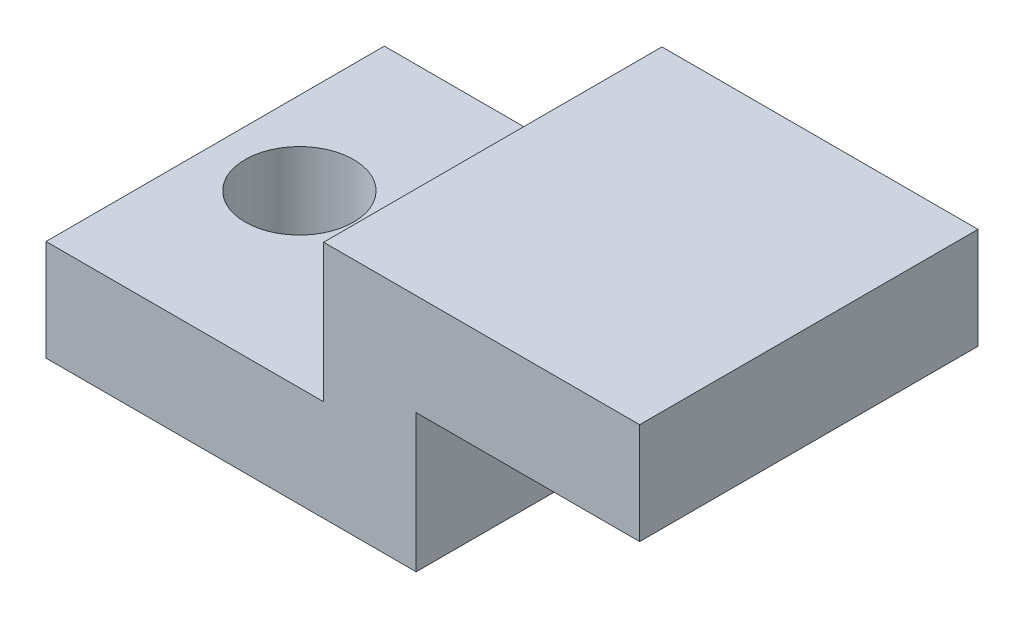
ISO-10303-21;
HEADER;
FILE_DESCRIPTION(('STEP AP214'),'2;1');
FILE_NAME('part.step','',(''),(''),'','','');
FILE_SCHEMA(('AUTOMOTIVE_DESIGN { 1 0 10303 214 1 1 1 1 }'));
ENDSEC;
DATA;
#1=APPLICATION_CONTEXT('core data for automotive mechanical design processes');
#2=APPLICATION_PROTOCOL_DEFINITION('international standard','automotive_design',2000,#1);
#3=PRODUCT_CONTEXT('',#1,'mechanical');
#4=PRODUCT('Part','Part','',(#3));
#5=PRODUCT_RELATED_PRODUCT_CATEGORY('part','',(#4));
#6=PRODUCT_DEFINITION_FORMATION('','',#4);
#7=PRODUCT_DEFINITION_CONTEXT('part definition',#1,'design');
#8=PRODUCT_DEFINITION('design','',#6,#7);
#9=PRODUCT_DEFINITION_SHAPE('','',#8);
#10=(LENGTH_UNIT() NAMED_UNIT(*) SI_UNIT(.MILLI.,.METRE.));
#11=(NAMED_UNIT(*) PLANE_ANGLE_UNIT() SI_UNIT($,.RADIAN.));
#12=(NAMED_UNIT(*) SI_UNIT($,.STERADIAN.) SOLID_ANGLE_UNIT());
#13=UNCERTAINTY_MEASURE_WITH_UNIT(LENGTH_MEASURE(1.E-05),#10,'distance_accuracy_value','');
#14=(GEOMETRIC_REPRESENTATION_CONTEXT(3) GLOBAL_UNCERTAINTY_ASSIGNED_CONTEXT((#13)) GLOBAL_UNIT_ASSIGNED_CONTEXT((#10,
#11,#12)) REPRESENTATION_CONTEXT('',''));
#15=CARTESIAN_POINT('',(0.,0.,0.));
#16=DIRECTION('',(0.,0.,1.));
#17=DIRECTION('',(1.,0.,0.));
#18=AXIS2_PLACEMENT_3D('',#15,#16,#17);
#19=CARTESIAN_POINT('',(-32.513558384062,-2.48482413759326,50.));
#20=DIRECTION('',(1.,0.,0.));
#21=DIRECTION('',(0.,0.,-1.));
#22=AXIS2_PLACEMENT_3D('',#19,#20,#21);
#23=PLANE('',#22);
#24=DIRECTION('',(0.,-1.,0.));
#25=VECTOR('',#24,1.);
#26=CARTESIAN_POINT('',(-32.513558384062,-2.48482413759326,0.));
#27=LINE('',#26,#25);
#28=CARTESIAN_POINT('',(-32.513558384062,-2.48482413759326,0.));
#29=VERTEX_POINT('',#28);
#30=CARTESIAN_POINT('',(-32.513558384062,-17.4179777057475,0.));
#31=VERTEX_POINT('',#30);
#32=EDGE_CURVE('E140',#29,#31,#27,.T.);
#33=ORIENTED_EDGE('',*,*,#32,.T.);
#34=DIRECTION('',(0.,0.,-1.));
#35=VECTOR('',#34,1.);
#36=CARTESIAN_POINT('',(-32.513558384062,-17.4179777057475,50.));
#37=LINE('',#36,#35);
#38=CARTESIAN_POINT('',(-32.513558384062,-17.4179777057475,50.));
#39=VERTEX_POINT('',#38);
#40=EDGE_CURVE('E11',#39,#31,#37,.T.);
#41=ORIENTED_EDGE('',*,*,#40,.F.);
#42=DIRECTION('',(0.,-1.,0.));
#43=VECTOR('',#42,1.);
#44=CARTESIAN_POINT('',(-32.513558384062,-2.48482413759326,50.));
#45=LINE('',#44,#43);
#46=CARTESIAN_POINT('',(-32.513558384062,-2.48482413759326,50.));
#47=VERTEX_POINT('',#46);
#48=EDGE_CURVE('E163',#47,#39,#45,.T.);
#49=ORIENTED_EDGE('',*,*,#48,.F.);
#50=DIRECTION('',(0.,0.,-1.));
#51=VECTOR('',#50,1.);
#52=CARTESIAN_POINT('',(-32.513558384062,-2.48482413759326,50.));
#53=LINE('',#52,#51);
#54=EDGE_CURVE('E136',#47,#29,#53,.T.);
#55=ORIENTED_EDGE('',*,*,#54,.T.);
#56=EDGE_LOOP('',(#33,#41,#49,#55));
#57=FACE_BOUND('',#56,.T.);
#58=ADVANCED_FACE('F39',(#57),#23,.F.);
#59=CARTESIAN_POINT('',(-32.513558384062,-17.4179777057475,50.));
#60=DIRECTION('',(0.,1.,0.));
#61=DIRECTION('',(0.,0.,1.));
#62=AXIS2_PLACEMENT_3D('',#59,#60,#61);
#63=PLANE('',#62);
#64=CARTESIAN_POINT('',(-20.2716755161703,-17.4179777057475,24.7924170990288));
#65=DIRECTION('',(0.,1.,0.));
#66=DIRECTION('',(0.,0.,1.));
#67=AXIS2_PLACEMENT_3D('',#64,#65,#66);
#68=CIRCLE('',#67,8.01591074055221);
#69=CARTESIAN_POINT('',(-20.2716755161703,-17.4179777057475,32.808327839581));
#70=VERTEX_POINT('',#69);
#71=EDGE_CURVE('E145',#70,#70,#68,.T.);
#72=ORIENTED_EDGE('',*,*,#71,.T.);
#73=EDGE_LOOP('',(#72));
#74=FACE_BOUND('',#73,.T.);
#75=DIRECTION('',(1.,0.,0.));
#76=VECTOR('',#75,1.);
#77=CARTESIAN_POINT('',(-32.513558384062,-17.4179777057475,0.));
#78=LINE('',#77,#76);
#79=CARTESIAN_POINT('',(22.1917938176931,-17.4179777057475,0.));
#80=VERTEX_POINT('',#79);
#81=EDGE_CURVE('E144',#31,#80,#78,.T.);
#82=ORIENTED_EDGE('',*,*,#81,.T.);
#83=DIRECTION('',(0.,0.,-1.));
#84=VECTOR('',#83,1.);
#85=CARTESIAN_POINT('',(22.1917938176931,-17.4179777057475,50.));
#86=LINE('',#85,#84);
#87=CARTESIAN_POINT('',(22.1917938176931,-17.4179777057475,50.));
#88=VERTEX_POINT('',#87);
#89=EDGE_CURVE('E48',#88,#80,#86,.T.);
#90=ORIENTED_EDGE('',*,*,#89,.F.);
#91=DIRECTION('',(1.,0.,0.));
#92=VECTOR('',#91,1.);
#93=CARTESIAN_POINT('',(-32.513558384062,-17.4179777057475,50.));
#94=LINE('',#93,#92);
#95=EDGE_CURVE('E99',#39,#88,#94,.T.);
#96=ORIENTED_EDGE('',*,*,#95,.F.);
#97=ORIENTED_EDGE('',*,*,#40,.T.);
#98=EDGE_LOOP('',(#82,#90,#96,#97));
#99=FACE_BOUND('',#98,.T.);
#100=ADVANCED_FACE('F229',(#74,#99),#63,.F.);
#101=CARTESIAN_POINT('',(22.1917938176931,-17.4179777057475,50.));
#102=DIRECTION('',(-1.,0.,0.));
#103=DIRECTION('',(0.,0.,1.));
#104=AXIS2_PLACEMENT_3D('',#101,#102,#103);
#105=PLANE('',#104);
#106=DIRECTION('',(0.,1.,0.));
#107=VECTOR('',#106,1.);
#108=CARTESIAN_POINT('',(22.1917938176931,-17.4179777057475,0.));
#109=LINE('',#108,#107);
#110=CARTESIAN_POINT('',(22.1917938176931,2.96750731283106,0.));
#111=VERTEX_POINT('',#110);
#112=EDGE_CURVE('E148',#80,#111,#109,.T.);
#113=ORIENTED_EDGE('',*,*,#112,.T.);
#114=DIRECTION('',(0.,0.,-1.));
#115=VECTOR('',#114,1.);
#116=CARTESIAN_POINT('',(22.1917938176931,2.96750731283106,50.));
#117=LINE('',#116,#115);
#118=CARTESIAN_POINT('',(22.1917938176931,2.96750731283106,50.));
#119=VERTEX_POINT('',#118);
#120=EDGE_CURVE('E174',#119,#111,#117,.T.);
#121=ORIENTED_EDGE('',*,*,#120,.F.);
#122=DIRECTION('',(0.,1.,0.));
#123=VECTOR('',#122,1.);
#124=CARTESIAN_POINT('',(22.1917938176931,-17.4179777057475,50.));
#125=LINE('',#124,#123);
#126=EDGE_CURVE('E184',#88,#119,#125,.T.);
#127=ORIENTED_EDGE('',*,*,#126,.F.);
#128=ORIENTED_EDGE('',*,*,#89,.T.);
#129=EDGE_LOOP('',(#113,#121,#127,#128));
#130=FACE_BOUND('',#129,.T.);
#131=ADVANCED_FACE('F182',(#130),#105,.F.);
#132=CARTESIAN_POINT('',(22.1917938176931,2.96750731283106,50.));
#133=DIRECTION('',(0.,1.,0.));
#134=DIRECTION('',(0.,0.,1.));
#135=AXIS2_PLACEMENT_3D('',#132,#133,#134);
#136=PLANE('',#135);
#137=DIRECTION('',(1.,0.,0.));
#138=VECTOR('',#137,1.);
#139=CARTESIAN_POINT('',(22.1917938176931,2.96750731283106,0.));
#140=LINE('',#139,#138);
#141=CARTESIAN_POINT('',(55.2214404300735,2.96750731283106,0.));
#142=VERTEX_POINT('',#141);
#143=EDGE_CURVE('E151',#111,#142,#140,.T.);
#144=ORIENTED_EDGE('',*,*,#143,.T.);
#145=DIRECTION('',(0.,0.,-1.));
#146=VECTOR('',#145,1.);
#147=CARTESIAN_POINT('',(55.2214404300735,2.96750731283106,50.));
#148=LINE('',#147,#146);
#149=CARTESIAN_POINT('',(55.2214404300735,2.96750731283106,50.));
#150=VERTEX_POINT('',#149);
#151=EDGE_CURVE('E170',#150,#142,#148,.T.);
#152=ORIENTED_EDGE('',*,*,#151,.F.);
#153=DIRECTION('',(1.,0.,0.));
#154=VECTOR('',#153,1.);
#155=CARTESIAN_POINT('',(22.1917938176931,2.96750731283106,50.));
#156=LINE('',#155,#154);
#157=EDGE_CURVE('E197',#119,#150,#156,.T.);
#158=ORIENTED_EDGE('',*,*,#157,.F.);
#159=ORIENTED_EDGE('',*,*,#120,.T.);
#160=EDGE_LOOP('',(#144,#152,#158,#159));
#161=FACE_BOUND('',#160,.T.);
#162=ADVANCED_FACE('F192',(#161),#136,.F.);
#163=CARTESIAN_POINT('',(55.2214404300735,2.96750731283106,50.));
#164=DIRECTION('',(-1.,0.,0.));
#165=DIRECTION('',(0.,0.,1.));
#166=AXIS2_PLACEMENT_3D('',#163,#164,#165);
#167=PLANE('',#166);
#168=DIRECTION('',(0.,1.,0.));
#169=VECTOR('',#168,1.);
#170=CARTESIAN_POINT('',(55.2214404300735,2.96750731283106,0.));
#171=LINE('',#170,#169);
#172=CARTESIAN_POINT('',(55.2214404300735,17.9340659340659,0.));
#173=VERTEX_POINT('',#172);
#174=EDGE_CURVE('E154',#142,#173,#171,.T.);
#175=ORIENTED_EDGE('',*,*,#174,.T.);
#176=DIRECTION('',(0.,0.,-1.));
#177=VECTOR('',#176,1.);
#178=CARTESIAN_POINT('',(55.2214404300735,17.9340659340659,50.));
#179=LINE('',#178,#177);
#180=CARTESIAN_POINT('',(55.2214404300735,17.9340659340659,50.));
#181=VERTEX_POINT('',#180);
#182=EDGE_CURVE('E129',#181,#173,#179,.T.);
#183=ORIENTED_EDGE('',*,*,#182,.F.);
#184=DIRECTION('',(0.,1.,0.));
#185=VECTOR('',#184,1.);
#186=CARTESIAN_POINT('',(55.2214404300735,2.96750731283106,50.));
#187=LINE('',#186,#185);
#188=EDGE_CURVE('E118',#150,#181,#187,.T.);
#189=ORIENTED_EDGE('',*,*,#188,.F.);
#190=ORIENTED_EDGE('',*,*,#151,.T.);
#191=EDGE_LOOP('',(#175,#183,#189,#190));
#192=FACE_BOUND('',#191,.T.);
#193=ADVANCED_FACE('F195',(#192),#167,.F.);
#194=CARTESIAN_POINT('',(55.2214404300735,17.9340659340659,50.));
#195=DIRECTION('',(0.,-1.,0.));
#196=DIRECTION('',(1.,0.,0.));
#197=AXIS2_PLACEMENT_3D('',#194,#195,#196);
#198=PLANE('',#197);
#199=DIRECTION('',(-1.,0.,0.));
#200=VECTOR('',#199,1.);
#201=CARTESIAN_POINT('',(55.2214404300735,17.9340659340659,0.));
#202=LINE('',#201,#200);
#203=CARTESIAN_POINT('',(8.51545576725432,17.9340659340659,0.));
#204=VERTEX_POINT('',#203);
#205=EDGE_CURVE('E127',#173,#204,#202,.T.);
#206=ORIENTED_EDGE('',*,*,#205,.T.);
#207=DIRECTION('',(0.,0.,-1.));
#208=VECTOR('',#207,1.);
#209=CARTESIAN_POINT('',(8.51545576725432,17.9340659340659,50.));
#210=LINE('',#209,#208);
#211=CARTESIAN_POINT('',(8.51545576725432,17.9340659340659,50.));
#212=VERTEX_POINT('',#211);
#213=EDGE_CURVE('E124',#212,#204,#210,.T.);
#214=ORIENTED_EDGE('',*,*,#213,.F.);
#215=DIRECTION('',(-1.,0.,0.));
#216=VECTOR('',#215,1.);
#217=CARTESIAN_POINT('',(55.2214404300735,17.9340659340659,50.));
#218=LINE('',#217,#216);
#219=EDGE_CURVE('E112',#181,#212,#218,.T.);
#220=ORIENTED_EDGE('',*,*,#219,.F.);
#221=ORIENTED_EDGE('',*,*,#182,.T.);
#222=EDGE_LOOP('',(#206,#214,#220,#221));
#223=FACE_BOUND('',#222,.T.);
#224=ADVANCED_FACE('F125',(#223),#198,.F.);
#225=CARTESIAN_POINT('',(8.51545576725432,17.9340659340659,50.));
#226=DIRECTION('',(1.,0.,0.));
#227=DIRECTION('',(0.,1.,0.));
#228=AXIS2_PLACEMENT_3D('',#225,#226,#227);
#229=PLANE('',#228);
#230=DIRECTION('',(0.,-1.,0.));
#231=VECTOR('',#230,1.);
#232=CARTESIAN_POINT('',(8.51545576725432,17.9340659340659,0.));
#233=LINE('',#232,#231);
#234=CARTESIAN_POINT('',(8.51545576725433,-2.48482413759326,0.));
#235=VERTEX_POINT('',#234);
#236=EDGE_CURVE('E85',#204,#235,#233,.T.);
#237=ORIENTED_EDGE('',*,*,#236,.T.);
#238=DIRECTION('',(0.,0.,-1.));
#239=VECTOR('',#238,1.);
#240=CARTESIAN_POINT('',(8.51545576725433,-2.48482413759326,50.));
#241=LINE('',#240,#239);
#242=CARTESIAN_POINT('',(8.51545576725433,-2.48482413759326,50.));
#243=VERTEX_POINT('',#242);
#244=EDGE_CURVE('E130',#243,#235,#241,.T.);
#245=ORIENTED_EDGE('',*,*,#244,.F.);
#246=DIRECTION('',(0.,-1.,0.));
#247=VECTOR('',#246,1.);
#248=CARTESIAN_POINT('',(8.51545576725432,17.9340659340659,50.));
#249=LINE('',#248,#247);
#250=EDGE_CURVE('E116',#212,#243,#249,.T.);
#251=ORIENTED_EDGE('',*,*,#250,.F.);
#252=ORIENTED_EDGE('',*,*,#213,.T.);
#253=EDGE_LOOP('',(#237,#245,#251,#252));
#254=FACE_BOUND('',#253,.T.);
#255=ADVANCED_FACE('F132',(#254),#229,.F.);
#256=CARTESIAN_POINT('',(8.51545576725433,-2.48482413759326,50.));
#257=DIRECTION('',(0.,-1.,0.));
#258=DIRECTION('',(0.,0.,-1.));
#259=AXIS2_PLACEMENT_3D('',#256,#257,#258);
#260=PLANE('',#259);
#261=CARTESIAN_POINT('',(-20.2716755161703,-2.48482413759326,24.7924170990288));
#262=DIRECTION('',(0.,1.,0.));
#263=DIRECTION('',(0.,0.,1.));
#264=AXIS2_PLACEMENT_3D('',#261,#262,#263);
#265=CIRCLE('',#264,8.01591074055221);
#266=CARTESIAN_POINT('',(-20.2716755161703,-2.48482413759326,32.808327839581));
#267=VERTEX_POINT('',#266);
#268=EDGE_CURVE('E210',#267,#267,#265,.T.);
#269=ORIENTED_EDGE('',*,*,#268,.F.);
#270=EDGE_LOOP('',(#269));
#271=FACE_BOUND('',#270,.T.);
#272=DIRECTION('',(-1.,0.,0.));
#273=VECTOR('',#272,1.);
#274=CARTESIAN_POINT('',(8.51545576725433,-2.48482413759326,0.));
#275=LINE('',#274,#273);
#276=EDGE_CURVE('E91',#235,#29,#275,.T.);
#277=ORIENTED_EDGE('',*,*,#276,.T.);
#278=ORIENTED_EDGE('',*,*,#54,.F.);
#279=DIRECTION('',(-1.,0.,0.));
#280=VECTOR('',#279,1.);
#281=CARTESIAN_POINT('',(8.51545576725433,-2.48482413759326,50.));
#282=LINE('',#281,#280);
#283=EDGE_CURVE('E56',#243,#47,#282,.T.);
#284=ORIENTED_EDGE('',*,*,#283,.F.);
#285=ORIENTED_EDGE('',*,*,#244,.T.);
#286=EDGE_LOOP('',(#277,#278,#284,#285));
#287=FACE_BOUND('',#286,.T.);
#288=ADVANCED_FACE('F218',(#271,#287),#260,.F.);
#289=CARTESIAN_POINT('',(0.,0.,50.));
#290=DIRECTION('',(0.,0.,1.));
#291=DIRECTION('',(1.,0.,0.));
#292=AXIS2_PLACEMENT_3D('',#289,#290,#291);
#293=PLANE('',#292);
#294=ORIENTED_EDGE('',*,*,#48,.T.);
#295=ORIENTED_EDGE('',*,*,#95,.T.);
#296=ORIENTED_EDGE('',*,*,#126,.T.);
#297=ORIENTED_EDGE('',*,*,#157,.T.);
#298=ORIENTED_EDGE('',*,*,#188,.T.);
#299=ORIENTED_EDGE('',*,*,#219,.T.);
#300=ORIENTED_EDGE('',*,*,#250,.T.);
#301=ORIENTED_EDGE('',*,*,#283,.T.);
#302=EDGE_LOOP('',(#294,#295,#296,#297,#298,#299,#300,#301));
#303=FACE_BOUND('',#302,.T.);
#304=ADVANCED_FACE('F114',(#303),#293,.T.);
#305=CARTESIAN_POINT('',(0.,0.,0.));
#306=DIRECTION('',(0.,0.,1.));
#307=DIRECTION('',(1.,0.,0.));
#308=AXIS2_PLACEMENT_3D('',#305,#306,#307);
#309=PLANE('',#308);
#310=ORIENTED_EDGE('',*,*,#32,.F.);
#311=ORIENTED_EDGE('',*,*,#276,.F.);
#312=ORIENTED_EDGE('',*,*,#236,.F.);
#313=ORIENTED_EDGE('',*,*,#205,.F.);
#314=ORIENTED_EDGE('',*,*,#174,.F.);
#315=ORIENTED_EDGE('',*,*,#143,.F.);
#316=ORIENTED_EDGE('',*,*,#112,.F.);
#317=ORIENTED_EDGE('',*,*,#81,.F.);
#318=EDGE_LOOP('',(#310,#311,#312,#313,#314,#315,#316,#317));
#319=FACE_BOUND('',#318,.T.);
#320=ADVANCED_FACE('F188',(#319),#309,.F.);
#321=CARTESIAN_POINT('',(-20.2716755161703,-52.4848241375933,24.7924170990288));
#322=DIRECTION('',(0.,1.,0.));
#323=DIRECTION('',(0.,0.,1.));
#324=AXIS2_PLACEMENT_3D('',#321,#322,#323);
#325=CYLINDRICAL_SURFACE('',#324,8.01591074055221);
#326=ORIENTED_EDGE('',*,*,#268,.T.);
#327=EDGE_LOOP('',(#326));
#328=FACE_BOUND('',#327,.T.);
#329=ORIENTED_EDGE('',*,*,#71,.F.);
#330=EDGE_LOOP('',(#329));
#331=FACE_BOUND('',#330,.T.);
#332=ADVANCED_FACE('F215',(#328,#331),#325,.F.);
#333=CLOSED_SHELL('',(#58,#100,#131,#162,#193,#224,#255,#288,#304,#320,#332));
#334=MANIFOLD_SOLID_BREP('B2',#333);
#335=ADVANCED_BREP_SHAPE_REPRESENTATION('',(#18,#334),#14);
#336=SHAPE_DEFINITION_REPRESENTATION(#9,#335);
ENDSEC;
END-ISO-10303-21;
